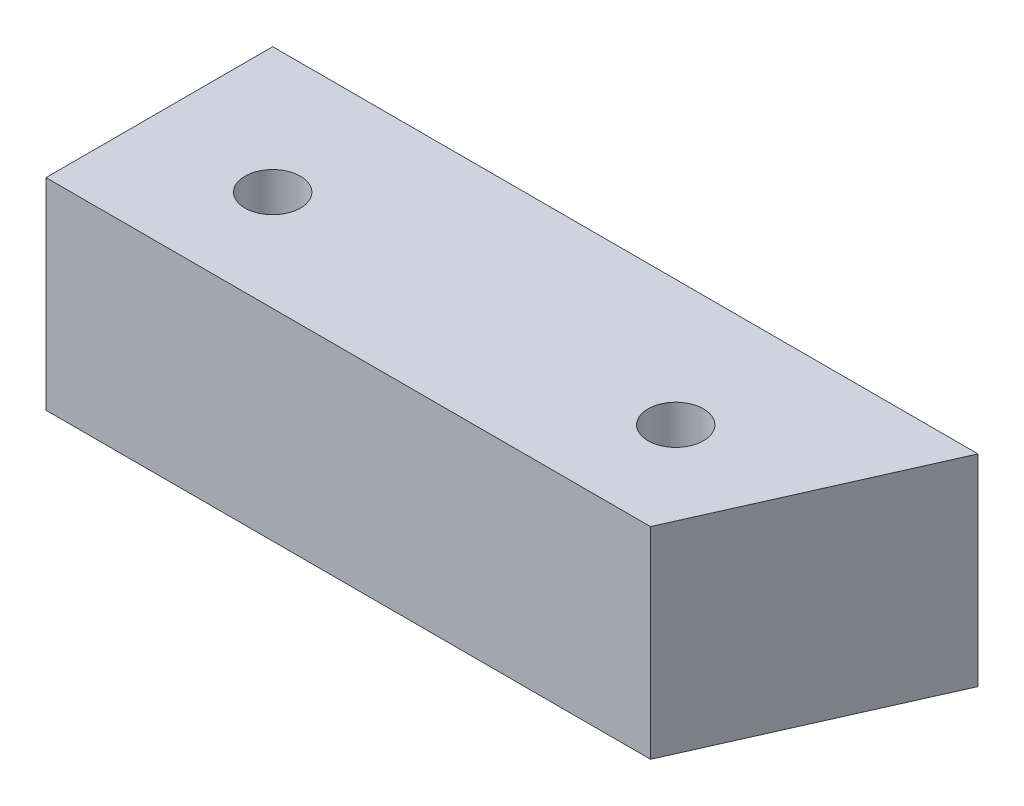
ISO-10303-21;
HEADER;
FILE_DESCRIPTION(('STEP AP214'),'2;1');
FILE_NAME('part.step','',(''),(''),'','','');
FILE_SCHEMA(('AUTOMOTIVE_DESIGN { 1 0 10303 214 1 1 1 1 }'));
ENDSEC;
DATA;
#1=APPLICATION_CONTEXT('core data for automotive mechanical design processes');
#2=APPLICATION_PROTOCOL_DEFINITION('international standard','automotive_design',2000,#1);
#3=PRODUCT_CONTEXT('',#1,'mechanical');
#4=PRODUCT('Part','Part','',(#3));
#5=PRODUCT_RELATED_PRODUCT_CATEGORY('part','',(#4));
#6=PRODUCT_DEFINITION_FORMATION('','',#4);
#7=PRODUCT_DEFINITION_CONTEXT('part definition',#1,'design');
#8=PRODUCT_DEFINITION('design','',#6,#7);
#9=PRODUCT_DEFINITION_SHAPE('','',#8);
#10=(LENGTH_UNIT() NAMED_UNIT(*) SI_UNIT(.MILLI.,.METRE.));
#11=(NAMED_UNIT(*) PLANE_ANGLE_UNIT() SI_UNIT($,.RADIAN.));
#12=(NAMED_UNIT(*) SI_UNIT($,.STERADIAN.) SOLID_ANGLE_UNIT());
#13=UNCERTAINTY_MEASURE_WITH_UNIT(LENGTH_MEASURE(1.E-05),#10,'distance_accuracy_value','');
#14=(GEOMETRIC_REPRESENTATION_CONTEXT(3) GLOBAL_UNCERTAINTY_ASSIGNED_CONTEXT((#13)) GLOBAL_UNIT_ASSIGNED_CONTEXT((#10,
#11,#12)) REPRESENTATION_CONTEXT('',''));
#15=CARTESIAN_POINT('',(0.,0.,0.));
#16=DIRECTION('',(0.,0.,1.));
#17=DIRECTION('',(1.,0.,0.));
#18=AXIS2_PLACEMENT_3D('',#15,#16,#17);
#19=CARTESIAN_POINT('',(0.,0.,45.));
#20=DIRECTION('',(1.,0.,0.));
#21=DIRECTION('',(0.,0.,-1.));
#22=AXIS2_PLACEMENT_3D('',#19,#20,#21);
#23=PLANE('',#22);
#24=DIRECTION('',(0.,-1.,0.));
#25=VECTOR('',#24,1.);
#26=CARTESIAN_POINT('',(0.,0.,0.));
#27=LINE('',#26,#25);
#28=CARTESIAN_POINT('',(0.,40.,0.));
#29=VERTEX_POINT('',#28);
#30=CARTESIAN_POINT('',(0.,0.,0.));
#31=VERTEX_POINT('',#30);
#32=EDGE_CURVE('E88',#29,#31,#27,.T.);
#33=ORIENTED_EDGE('',*,*,#32,.T.);
#34=DIRECTION('',(0.,0.,-1.));
#35=VECTOR('',#34,1.);
#36=CARTESIAN_POINT('',(0.,0.,45.));
#37=LINE('',#36,#35);
#38=CARTESIAN_POINT('',(0.,0.,45.));
#39=VERTEX_POINT('',#38);
#40=EDGE_CURVE('E11',#39,#31,#37,.T.);
#41=ORIENTED_EDGE('',*,*,#40,.F.);
#42=DIRECTION('',(0.,-1.,0.));
#43=VECTOR('',#42,1.);
#44=CARTESIAN_POINT('',(0.,0.,45.));
#45=LINE('',#44,#43);
#46=CARTESIAN_POINT('',(0.,40.,45.));
#47=VERTEX_POINT('',#46);
#48=EDGE_CURVE('E82',#47,#39,#45,.T.);
#49=ORIENTED_EDGE('',*,*,#48,.F.);
#50=DIRECTION('',(0.,0.,-1.));
#51=VECTOR('',#50,1.);
#52=CARTESIAN_POINT('',(0.,40.,45.));
#53=LINE('',#52,#51);
#54=EDGE_CURVE('E43',#47,#29,#53,.T.);
#55=ORIENTED_EDGE('',*,*,#54,.T.);
#56=EDGE_LOOP('',(#33,#41,#49,#55));
#57=FACE_BOUND('',#56,.T.);
#58=ADVANCED_FACE('F35',(#57),#23,.F.);
#59=CARTESIAN_POINT('',(0.,0.,45.));
#60=DIRECTION('',(0.,1.,0.));
#61=DIRECTION('',(0.,0.,1.));
#62=AXIS2_PLACEMENT_3D('',#59,#60,#61);
#63=PLANE('',#62);
#64=CARTESIAN_POINT('',(25.,0.,25.));
#65=DIRECTION('',(0.,-1.,0.));
#66=DIRECTION('',(0.,0.,-1.));
#67=AXIS2_PLACEMENT_3D('',#64,#65,#66);
#68=CIRCLE('',#67,5.5);
#69=CARTESIAN_POINT('',(25.,0.,19.5));
#70=VERTEX_POINT('',#69);
#71=EDGE_CURVE('E118',#70,#70,#68,.T.);
#72=ORIENTED_EDGE('',*,*,#71,.F.);
#73=EDGE_LOOP('',(#72));
#74=FACE_BOUND('',#73,.T.);
#75=CARTESIAN_POINT('',(105.,0.,25.));
#76=DIRECTION('',(0.,-1.,0.));
#77=DIRECTION('',(0.,0.,-1.));
#78=AXIS2_PLACEMENT_3D('',#75,#76,#77);
#79=CIRCLE('',#78,5.5);
#80=CARTESIAN_POINT('',(105.,0.,19.5));
#81=VERTEX_POINT('',#80);
#82=EDGE_CURVE('E111',#81,#81,#79,.T.);
#83=ORIENTED_EDGE('',*,*,#82,.F.);
#84=EDGE_LOOP('',(#83));
#85=FACE_BOUND('',#84,.T.);
#86=DIRECTION('',(1.,0.,0.));
#87=VECTOR('',#86,1.);
#88=CARTESIAN_POINT('',(0.,0.,0.));
#89=LINE('',#88,#87);
#90=CARTESIAN_POINT('',(140.,0.,0.));
#91=VERTEX_POINT('',#90);
#92=EDGE_CURVE('E90',#31,#91,#89,.T.);
#93=ORIENTED_EDGE('',*,*,#92,.T.);
#94=DIRECTION('',(0.406138466053448,0.,-0.913811548620257));
#95=VECTOR('',#94,1.);
#96=CARTESIAN_POINT('',(140.,0.,0.));
#97=LINE('',#96,#95);
#98=CARTESIAN_POINT('',(120.,0.,45.));
#99=VERTEX_POINT('',#98);
#100=EDGE_CURVE('E66',#99,#91,#97,.T.);
#101=ORIENTED_EDGE('',*,*,#100,.F.);
#102=DIRECTION('',(1.,0.,0.));
#103=VECTOR('',#102,1.);
#104=CARTESIAN_POINT('',(0.,0.,45.));
#105=LINE('',#104,#103);
#106=EDGE_CURVE('E105',#39,#99,#105,.T.);
#107=ORIENTED_EDGE('',*,*,#106,.F.);
#108=ORIENTED_EDGE('',*,*,#40,.T.);
#109=EDGE_LOOP('',(#93,#101,#107,#108));
#110=FACE_BOUND('',#109,.T.);
#111=ADVANCED_FACE('F104',(#74,#85,#110),#63,.F.);
#112=CARTESIAN_POINT('',(0.,40.,45.));
#113=DIRECTION('',(0.,-1.,0.));
#114=DIRECTION('',(0.,0.,-1.));
#115=AXIS2_PLACEMENT_3D('',#112,#113,#114);
#116=PLANE('',#115);
#117=CARTESIAN_POINT('',(25.,40.,25.));
#118=DIRECTION('',(0.,-1.,0.));
#119=DIRECTION('',(0.,0.,-1.));
#120=AXIS2_PLACEMENT_3D('',#117,#118,#119);
#121=CIRCLE('',#120,5.5);
#122=CARTESIAN_POINT('',(25.,40.,19.5));
#123=VERTEX_POINT('',#122);
#124=EDGE_CURVE('E106',#123,#123,#121,.T.);
#125=ORIENTED_EDGE('',*,*,#124,.T.);
#126=EDGE_LOOP('',(#125));
#127=FACE_BOUND('',#126,.T.);
#128=CARTESIAN_POINT('',(105.,40.,25.));
#129=DIRECTION('',(0.,-1.,0.));
#130=DIRECTION('',(0.,0.,-1.));
#131=AXIS2_PLACEMENT_3D('',#128,#129,#130);
#132=CIRCLE('',#131,5.5);
#133=CARTESIAN_POINT('',(105.,40.,19.5));
#134=VERTEX_POINT('',#133);
#135=EDGE_CURVE('E114',#134,#134,#132,.T.);
#136=ORIENTED_EDGE('',*,*,#135,.T.);
#137=EDGE_LOOP('',(#136));
#138=FACE_BOUND('',#137,.T.);
#139=DIRECTION('',(-1.,0.,0.));
#140=VECTOR('',#139,1.);
#141=CARTESIAN_POINT('',(0.,40.,45.));
#142=LINE('',#141,#140);
#143=CARTESIAN_POINT('',(120.,40.,45.));
#144=VERTEX_POINT('',#143);
#145=EDGE_CURVE('E51',#144,#47,#142,.T.);
#146=ORIENTED_EDGE('',*,*,#145,.F.);
#147=DIRECTION('',(0.406138466053448,0.,-0.913811548620257));
#148=VECTOR('',#147,1.);
#149=CARTESIAN_POINT('',(140.,40.,0.));
#150=LINE('',#149,#148);
#151=CARTESIAN_POINT('',(140.,40.,0.));
#152=VERTEX_POINT('',#151);
#153=EDGE_CURVE('E78',#144,#152,#150,.T.);
#154=ORIENTED_EDGE('',*,*,#153,.T.);
#155=DIRECTION('',(-1.,0.,0.));
#156=VECTOR('',#155,1.);
#157=CARTESIAN_POINT('',(0.,40.,0.));
#158=LINE('',#157,#156);
#159=EDGE_CURVE('E72',#152,#29,#158,.T.);
#160=ORIENTED_EDGE('',*,*,#159,.T.);
#161=ORIENTED_EDGE('',*,*,#54,.F.);
#162=EDGE_LOOP('',(#146,#154,#160,#161));
#163=FACE_BOUND('',#162,.T.);
#164=ADVANCED_FACE('F74',(#127,#138,#163),#116,.F.);
#165=CARTESIAN_POINT('',(0.,0.,45.));
#166=DIRECTION('',(0.,0.,-1.));
#167=DIRECTION('',(-1.,0.,0.));
#168=AXIS2_PLACEMENT_3D('',#165,#166,#167);
#169=PLANE('',#168);
#170=ORIENTED_EDGE('',*,*,#106,.T.);
#171=DIRECTION('',(0.,-1.,0.));
#172=VECTOR('',#171,1.);
#173=CARTESIAN_POINT('',(120.,40.,45.));
#174=LINE('',#173,#172);
#175=EDGE_CURVE('E91',#144,#99,#174,.T.);
#176=ORIENTED_EDGE('',*,*,#175,.F.);
#177=ORIENTED_EDGE('',*,*,#145,.T.);
#178=ORIENTED_EDGE('',*,*,#48,.T.);
#179=EDGE_LOOP('',(#170,#176,#177,#178));
#180=FACE_BOUND('',#179,.T.);
#181=ADVANCED_FACE('F108',(#180),#169,.F.);
#182=CARTESIAN_POINT('',(0.,0.,0.));
#183=DIRECTION('',(0.,0.,-1.));
#184=DIRECTION('',(-1.,0.,0.));
#185=AXIS2_PLACEMENT_3D('',#182,#183,#184);
#186=PLANE('',#185);
#187=CARTESIAN_POINT('',(100.,25.,0.));
#188=DIRECTION('',(0.,0.,-1.));
#189=DIRECTION('',(-1.,0.,0.));
#190=AXIS2_PLACEMENT_3D('',#187,#188,#189);
#191=CIRCLE('',#190,2.5);
#192=CARTESIAN_POINT('',(97.5,25.,0.));
#193=VERTEX_POINT('',#192);
#194=EDGE_CURVE('E137',#193,#193,#191,.T.);
#195=ORIENTED_EDGE('',*,*,#194,.F.);
#196=EDGE_LOOP('',(#195));
#197=FACE_BOUND('',#196,.T.);
#198=CARTESIAN_POINT('',(40.,15.,0.));
#199=DIRECTION('',(0.,0.,-1.));
#200=DIRECTION('',(-1.,0.,0.));
#201=AXIS2_PLACEMENT_3D('',#198,#199,#200);
#202=CIRCLE('',#201,2.5);
#203=CARTESIAN_POINT('',(37.5,15.,0.));
#204=VERTEX_POINT('',#203);
#205=EDGE_CURVE('E130',#204,#204,#202,.T.);
#206=ORIENTED_EDGE('',*,*,#205,.F.);
#207=EDGE_LOOP('',(#206));
#208=FACE_BOUND('',#207,.T.);
#209=CARTESIAN_POINT('',(100.,15.,0.));
#210=DIRECTION('',(0.,0.,-1.));
#211=DIRECTION('',(-1.,0.,0.));
#212=AXIS2_PLACEMENT_3D('',#209,#210,#211);
#213=CIRCLE('',#212,2.5);
#214=CARTESIAN_POINT('',(97.5,15.,0.));
#215=VERTEX_POINT('',#214);
#216=EDGE_CURVE('E142',#215,#215,#213,.T.);
#217=ORIENTED_EDGE('',*,*,#216,.F.);
#218=EDGE_LOOP('',(#217));
#219=FACE_BOUND('',#218,.T.);
#220=CARTESIAN_POINT('',(40.,25.,0.));
#221=DIRECTION('',(0.,0.,-1.));
#222=DIRECTION('',(-1.,0.,0.));
#223=AXIS2_PLACEMENT_3D('',#220,#221,#222);
#224=CIRCLE('',#223,2.5);
#225=CARTESIAN_POINT('',(37.5,25.,0.));
#226=VERTEX_POINT('',#225);
#227=EDGE_CURVE('E124',#226,#226,#224,.T.);
#228=ORIENTED_EDGE('',*,*,#227,.F.);
#229=EDGE_LOOP('',(#228));
#230=FACE_BOUND('',#229,.T.);
#231=ORIENTED_EDGE('',*,*,#32,.F.);
#232=ORIENTED_EDGE('',*,*,#159,.F.);
#233=DIRECTION('',(0.,1.,0.));
#234=VECTOR('',#233,1.);
#235=CARTESIAN_POINT('',(140.,0.,0.));
#236=LINE('',#235,#234);
#237=EDGE_CURVE('E83',#91,#152,#236,.T.);
#238=ORIENTED_EDGE('',*,*,#237,.F.);
#239=ORIENTED_EDGE('',*,*,#92,.F.);
#240=EDGE_LOOP('',(#231,#232,#238,#239));
#241=FACE_BOUND('',#240,.T.);
#242=ADVANCED_FACE('F89',(#197,#208,#219,#230,#241),#186,.T.);
#243=CARTESIAN_POINT('',(140.,40.,0.));
#244=DIRECTION('',(-0.913811548620257,0.,-0.406138466053448));
#245=DIRECTION('',(-0.406138466053448,0.,0.913811548620257));
#246=AXIS2_PLACEMENT_3D('',#243,#244,#245);
#247=PLANE('',#246);
#248=ORIENTED_EDGE('',*,*,#100,.T.);
#249=ORIENTED_EDGE('',*,*,#237,.T.);
#250=ORIENTED_EDGE('',*,*,#153,.F.);
#251=ORIENTED_EDGE('',*,*,#175,.T.);
#252=EDGE_LOOP('',(#248,#249,#250,#251));
#253=FACE_BOUND('',#252,.T.);
#254=ADVANCED_FACE('F98',(#253),#247,.F.);
#255=CARTESIAN_POINT('',(105.,40.,25.));
#256=DIRECTION('',(0.,-1.,0.));
#257=DIRECTION('',(0.,0.,-1.));
#258=AXIS2_PLACEMENT_3D('',#255,#256,#257);
#259=CYLINDRICAL_SURFACE('',#258,5.5);
#260=ORIENTED_EDGE('',*,*,#135,.F.);
#261=EDGE_LOOP('',(#260));
#262=FACE_BOUND('',#261,.T.);
#263=ORIENTED_EDGE('',*,*,#82,.T.);
#264=EDGE_LOOP('',(#263));
#265=FACE_BOUND('',#264,.T.);
#266=ADVANCED_FACE('F174',(#262,#265),#259,.F.);
#267=CARTESIAN_POINT('',(25.,40.,25.));
#268=DIRECTION('',(0.,-1.,0.));
#269=DIRECTION('',(0.,0.,-1.));
#270=AXIS2_PLACEMENT_3D('',#267,#268,#269);
#271=CYLINDRICAL_SURFACE('',#270,5.5);
#272=ORIENTED_EDGE('',*,*,#124,.F.);
#273=EDGE_LOOP('',(#272));
#274=FACE_BOUND('',#273,.T.);
#275=ORIENTED_EDGE('',*,*,#71,.T.);
#276=EDGE_LOOP('',(#275));
#277=FACE_BOUND('',#276,.T.);
#278=ADVANCED_FACE('F165',(#274,#277),#271,.F.);
#279=CARTESIAN_POINT('',(40.,25.,20.));
#280=DIRECTION('',(0.,0.,-1.));
#281=DIRECTION('',(-1.,0.,0.));
#282=AXIS2_PLACEMENT_3D('',#279,#280,#281);
#283=CYLINDRICAL_SURFACE('',#282,2.5);
#284=CARTESIAN_POINT('',(40.,25.,20.));
#285=DIRECTION('',(0.,0.,-1.));
#286=DIRECTION('',(-1.,0.,0.));
#287=AXIS2_PLACEMENT_3D('',#284,#285,#286);
#288=CIRCLE('',#287,2.5);
#289=CARTESIAN_POINT('',(37.5,25.,20.));
#290=VERTEX_POINT('',#289);
#291=EDGE_CURVE('E115',#290,#290,#288,.T.);
#292=ORIENTED_EDGE('',*,*,#291,.F.);
#293=EDGE_LOOP('',(#292));
#294=FACE_BOUND('',#293,.T.);
#295=ORIENTED_EDGE('',*,*,#227,.T.);
#296=EDGE_LOOP('',(#295));
#297=FACE_BOUND('',#296,.T.);
#298=ADVANCED_FACE('F163',(#294,#297),#283,.F.);
#299=CARTESIAN_POINT('',(40.,25.,20.));
#300=DIRECTION('',(0.,0.,-1.));
#301=DIRECTION('',(-1.,0.,0.));
#302=AXIS2_PLACEMENT_3D('',#299,#300,#301);
#303=PLANE('',#302);
#304=ORIENTED_EDGE('',*,*,#291,.T.);
#305=EDGE_LOOP('',(#304));
#306=FACE_BOUND('',#305,.T.);
#307=ADVANCED_FACE('F153',(#306),#303,.T.);
#308=CARTESIAN_POINT('',(100.,15.,20.));
#309=DIRECTION('',(0.,0.,-1.));
#310=DIRECTION('',(-1.,0.,0.));
#311=AXIS2_PLACEMENT_3D('',#308,#309,#310);
#312=CYLINDRICAL_SURFACE('',#311,2.5);
#313=CARTESIAN_POINT('',(100.,15.,20.));
#314=DIRECTION('',(0.,0.,-1.));
#315=DIRECTION('',(-1.,0.,0.));
#316=AXIS2_PLACEMENT_3D('',#313,#314,#315);
#317=CIRCLE('',#316,2.5);
#318=CARTESIAN_POINT('',(97.5,15.,20.));
#319=VERTEX_POINT('',#318);
#320=EDGE_CURVE('E134',#319,#319,#317,.T.);
#321=ORIENTED_EDGE('',*,*,#320,.F.);
#322=EDGE_LOOP('',(#321));
#323=FACE_BOUND('',#322,.T.);
#324=ORIENTED_EDGE('',*,*,#216,.T.);
#325=EDGE_LOOP('',(#324));
#326=FACE_BOUND('',#325,.T.);
#327=ADVANCED_FACE('F150',(#323,#326),#312,.F.);
#328=CARTESIAN_POINT('',(100.,15.,20.));
#329=DIRECTION('',(0.,0.,-1.));
#330=DIRECTION('',(-1.,0.,0.));
#331=AXIS2_PLACEMENT_3D('',#328,#329,#330);
#332=PLANE('',#331);
#333=ORIENTED_EDGE('',*,*,#320,.T.);
#334=EDGE_LOOP('',(#333));
#335=FACE_BOUND('',#334,.T.);
#336=ADVANCED_FACE('F148',(#335),#332,.T.);
#337=CARTESIAN_POINT('',(40.,15.,20.));
#338=DIRECTION('',(0.,0.,-1.));
#339=DIRECTION('',(-1.,0.,0.));
#340=AXIS2_PLACEMENT_3D('',#337,#338,#339);
#341=CYLINDRICAL_SURFACE('',#340,2.5);
#342=CARTESIAN_POINT('',(40.,15.,20.));
#343=DIRECTION('',(0.,0.,-1.));
#344=DIRECTION('',(-1.,0.,0.));
#345=AXIS2_PLACEMENT_3D('',#342,#343,#344);
#346=CIRCLE('',#345,2.5);
#347=CARTESIAN_POINT('',(37.5,15.,20.));
#348=VERTEX_POINT('',#347);
#349=EDGE_CURVE('E133',#348,#348,#346,.T.);
#350=ORIENTED_EDGE('',*,*,#349,.F.);
#351=EDGE_LOOP('',(#350));
#352=FACE_BOUND('',#351,.T.);
#353=ORIENTED_EDGE('',*,*,#205,.T.);
#354=EDGE_LOOP('',(#353));
#355=FACE_BOUND('',#354,.T.);
#356=ADVANCED_FACE('F240',(#352,#355),#341,.F.);
#357=CARTESIAN_POINT('',(40.,15.,20.));
#358=DIRECTION('',(0.,0.,-1.));
#359=DIRECTION('',(-1.,0.,0.));
#360=AXIS2_PLACEMENT_3D('',#357,#358,#359);
#361=PLANE('',#360);
#362=ORIENTED_EDGE('',*,*,#349,.T.);
#363=EDGE_LOOP('',(#362));
#364=FACE_BOUND('',#363,.T.);
#365=ADVANCED_FACE('F249',(#364),#361,.T.);
#366=CARTESIAN_POINT('',(100.,25.,20.));
#367=DIRECTION('',(0.,0.,-1.));
#368=DIRECTION('',(-1.,0.,0.));
#369=AXIS2_PLACEMENT_3D('',#366,#367,#368);
#370=CYLINDRICAL_SURFACE('',#369,2.5);
#371=CARTESIAN_POINT('',(100.,25.,20.));
#372=DIRECTION('',(0.,0.,-1.));
#373=DIRECTION('',(-1.,0.,0.));
#374=AXIS2_PLACEMENT_3D('',#371,#372,#373);
#375=CIRCLE('',#374,2.5);
#376=CARTESIAN_POINT('',(97.5,25.,20.));
#377=VERTEX_POINT('',#376);
#378=EDGE_CURVE('E127',#377,#377,#375,.T.);
#379=ORIENTED_EDGE('',*,*,#378,.F.);
#380=EDGE_LOOP('',(#379));
#381=FACE_BOUND('',#380,.T.);
#382=ORIENTED_EDGE('',*,*,#194,.T.);
#383=EDGE_LOOP('',(#382));
#384=FACE_BOUND('',#383,.T.);
#385=ADVANCED_FACE('F259',(#381,#384),#370,.F.);
#386=CARTESIAN_POINT('',(100.,25.,20.));
#387=DIRECTION('',(0.,0.,-1.));
#388=DIRECTION('',(-1.,0.,0.));
#389=AXIS2_PLACEMENT_3D('',#386,#387,#388);
#390=PLANE('',#389);
#391=ORIENTED_EDGE('',*,*,#378,.T.);
#392=EDGE_LOOP('',(#391));
#393=FACE_BOUND('',#392,.T.);
#394=ADVANCED_FACE('F269',(#393),#390,.T.);
#395=CLOSED_SHELL('',(#58,#111,#164,#181,#242,#254,#266,#278,#298,#307,#327,#336,#356,#365,#385,#394));
#396=MANIFOLD_SOLID_BREP('B2',#395);
#397=ADVANCED_BREP_SHAPE_REPRESENTATION('',(#18,#396),#14);
#398=SHAPE_DEFINITION_REPRESENTATION(#9,#397);
ENDSEC;
END-ISO-10303-21;
